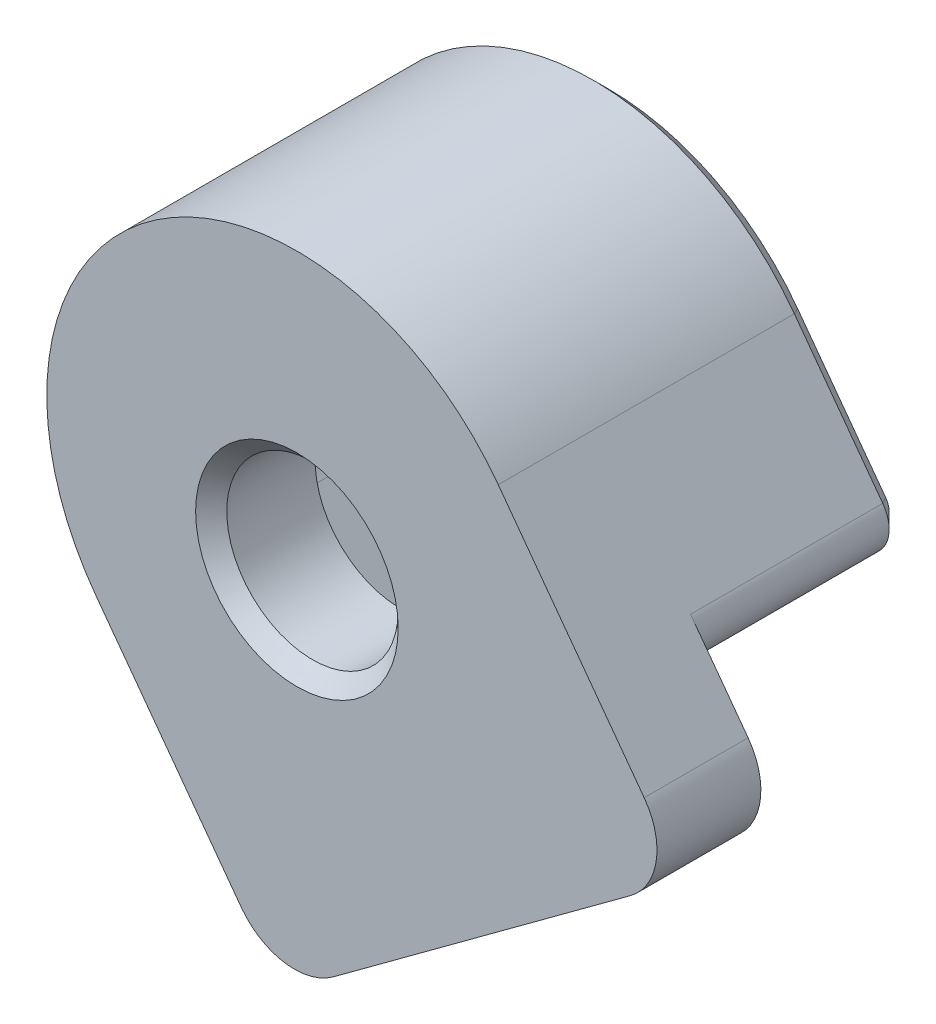
ISO-10303-21;
HEADER;
FILE_DESCRIPTION(('STEP AP214'),'2;1');
FILE_NAME('part.step','',(''),(''),'','','');
FILE_SCHEMA(('AUTOMOTIVE_DESIGN { 1 0 10303 214 1 1 1 1 }'));
ENDSEC;
DATA;
#1=APPLICATION_CONTEXT('core data for automotive mechanical design processes');
#2=APPLICATION_PROTOCOL_DEFINITION('international standard','automotive_design',2000,#1);
#3=PRODUCT_CONTEXT('',#1,'mechanical');
#4=PRODUCT('Part','Part','',(#3));
#5=PRODUCT_RELATED_PRODUCT_CATEGORY('part','',(#4));
#6=PRODUCT_DEFINITION_FORMATION('','',#4);
#7=PRODUCT_DEFINITION_CONTEXT('part definition',#1,'design');
#8=PRODUCT_DEFINITION('design','',#6,#7);
#9=PRODUCT_DEFINITION_SHAPE('','',#8);
#10=(LENGTH_UNIT() NAMED_UNIT(*) SI_UNIT(.MILLI.,.METRE.));
#11=(NAMED_UNIT(*) PLANE_ANGLE_UNIT() SI_UNIT($,.RADIAN.));
#12=(NAMED_UNIT(*) SI_UNIT($,.STERADIAN.) SOLID_ANGLE_UNIT());
#13=UNCERTAINTY_MEASURE_WITH_UNIT(LENGTH_MEASURE(1.E-05),#10,'distance_accuracy_value','');
#14=(GEOMETRIC_REPRESENTATION_CONTEXT(3) GLOBAL_UNCERTAINTY_ASSIGNED_CONTEXT((#13)) GLOBAL_UNIT_ASSIGNED_CONTEXT((#10,
#11,#12)) REPRESENTATION_CONTEXT('',''));
#15=CARTESIAN_POINT('',(0.,0.,0.));
#16=DIRECTION('',(0.,0.,1.));
#17=DIRECTION('',(1.,0.,0.));
#18=AXIS2_PLACEMENT_3D('',#15,#16,#17);
#19=CARTESIAN_POINT('',(-2.40553064477248,-2.97284184121243,-3.85));
#20=DIRECTION('',(0.569292299270593,0.419411823857176,-0.707106781186547));
#21=DIRECTION('',(-0.778926894631639,0.,-0.627114736567011));
#22=AXIS2_PLACEMENT_3D('',#19,#20,#21);
#23=PLANE('',#22);
#24=DIRECTION('',(0.569292299270616,0.419411823857143,0.707106781186548));
#25=VECTOR('',#24,1.);
#26=CARTESIAN_POINT('',(-401745.223635817,-295975.717899002,-499000.));
#27=LINE('',#26,#25);
#28=CARTESIAN_POINT('',(-3.09963842872968,-2.28358087467108,-3.9999999999955));
#29=VERTEX_POINT('',#28);
#30=CARTESIAN_POINT('',(-2.85810816154998,-2.10563950778295,-3.69999999996676));
#31=VERTEX_POINT('',#30);
#32=EDGE_CURVE('E313',#29,#31,#27,.T.);
#33=ORIENTED_EDGE('',*,*,#32,.T.);
#34=DIRECTION('',(-0.593137889518453,0.805100890583034,0.));
#35=VECTOR('',#34,1.);
#36=CARTESIAN_POINT('',(-2.85810816156989,-2.10563950779034,-3.7));
#37=LINE('',#36,#35);
#38=CARTESIAN_POINT('',(-1.15704800032344,-4.41458836262104,-3.70000000000939));
#39=VERTEX_POINT('',#38);
#40=EDGE_CURVE('E278',#39,#31,#37,.T.);
#41=ORIENTED_EDGE('',*,*,#40,.F.);
#42=CARTESIAN_POINT('',(-1.39857826747342,-4.59252972945821,-3.99999999996226));
#43=CARTESIAN_POINT('',(-1.3885145062315,-4.58511550605522,-3.98749999998533));
#44=CARTESIAN_POINT('',(-1.37845074500218,-4.57770128261609,-3.97500000001971));
#45=CARTESIAN_POINT('',(-1.35832322252214,-4.56287283565181,-3.95000000003162));
#46=CARTESIAN_POINT('',(-1.34825946127141,-4.55545861212668,-3.93750000000915));
#47=CARTESIAN_POINT('',(-1.32813193883925,-4.54063016507784,-3.91249999999846));
#48=CARTESIAN_POINT('',(-1.31806817765781,-4.53321594155415,-3.90000000001024));
#49=CARTESIAN_POINT('',(-1.29794065534354,-4.51838749442578,-3.8750000000125));
#50=CARTESIAN_POINT('',(-1.28787689421071,-4.51097327082111,-3.86250000000299));
#51=CARTESIAN_POINT('',(-1.26774937194871,-4.49614482357225,-3.8374999999892));
#52=CARTESIAN_POINT('',(-1.25768561081954,-4.48873059992806,-3.82499999998492));
#53=CARTESIAN_POINT('',(-1.23755808859704,-4.47390215259018,-3.79999999997688));
#54=CARTESIAN_POINT('',(-1.2274943275037,-4.46648792889649,-3.78749999997311));
#55=CARTESIAN_POINT('',(-1.20736680538268,-4.451659481458,-3.7624999999583));
#56=CARTESIAN_POINT('',(-1.19730304435498,-4.4442452577132,-3.74999999994726));
#57=CARTESIAN_POINT('',(-1.17717552233503,-4.42941681019444,-3.72499999996307));
#58=CARTESIAN_POINT('',(-1.16711176134277,-4.42200258642048,-3.71249999998993));
#59=CARTESIAN_POINT('',(-1.15704800033643,-4.41458836263061,-3.70000000003756));
#60=B_SPLINE_CURVE_WITH_KNOTS('',3,(#42,#43,#44,#45,#46,#47,#48,#49,#50,#51,#52,#53,#54,#55,#56,
#57,#58,#59),.UNSPECIFIED.,.F.,.F.,(4,2,2,2,2,2,2,2,4),(0.,0.053033008455504,0.106066017176354,
0.159099025704413,0.212132034296507,0.265165042920962,0.318198051545416,0.371231060137511,
0.424264068625375),.UNSPECIFIED.);
#61=CARTESIAN_POINT('',(-1.39857827143414,-4.59252972410357,-3.99999999996226));
#62=VERTEX_POINT('',#61);
#63=EDGE_CURVE('E294',#62,#39,#60,.T.);
#64=ORIENTED_EDGE('',*,*,#63,.F.);
#65=DIRECTION('',(-0.593137889518453,0.805100890583034,0.));
#66=VECTOR('',#65,1.);
#67=CARTESIAN_POINT('',(-1.39857826749393,-4.59252972947332,-4.));
#68=LINE('',#67,#66);
#69=EDGE_CURVE('E254',#62,#29,#68,.T.);
#70=ORIENTED_EDGE('',*,*,#69,.T.);
#71=EDGE_LOOP('',(#33,#41,#64,#70));
#72=FACE_BOUND('',#71,.T.);
#73=ADVANCED_FACE('F17',(#72),#23,.T.);
#74=CARTESIAN_POINT('',(0.,0.,-3.99999999990541));
#75=DIRECTION('',(0.,0.,-1.));
#76=DIRECTION('',(-1.,0.,0.));
#77=AXIS2_PLACEMENT_3D('',#74,#75,#76);
#78=CONICAL_SURFACE('',#77,3.84999999994307,0.785398163397448);
#79=CARTESIAN_POINT('',(0.,0.,-4.0000000000383));
#80=DIRECTION('',(0.,0.,-1.));
#81=DIRECTION('',(-1.,0.,0.));
#82=AXIS2_PLACEMENT_3D('',#79,#80,#81);
#83=CIRCLE('',#82,3.85000000007595);
#84=CARTESIAN_POINT('',(3.09963842876022,2.28358087465724,-4.00000000001915));
#85=VERTEX_POINT('',#84);
#86=EDGE_CURVE('E253',#29,#85,#83,.T.);
#87=ORIENTED_EDGE('',*,*,#86,.T.);
#88=DIRECTION('',(0.569292299270587,0.419411823857181,-0.707106781186549));
#89=VECTOR('',#88,1.);
#90=CARTESIAN_POINT('',(2.85810816156989,2.10563950779034,-3.7));
#91=LINE('',#90,#89);
#92=CARTESIAN_POINT('',(2.85810816156989,2.10563950779034,-3.7));
#93=VERTEX_POINT('',#92);
#94=EDGE_CURVE('E120',#93,#85,#91,.T.);
#95=ORIENTED_EDGE('',*,*,#94,.F.);
#96=CARTESIAN_POINT('',(0.,0.,-3.7));
#97=DIRECTION('',(0.,0.,-1.));
#98=DIRECTION('',(-1.,0.,0.));
#99=AXIS2_PLACEMENT_3D('',#96,#97,#98);
#100=CIRCLE('',#99,3.55);
#101=EDGE_CURVE('E289',#93,#31,#100,.F.);
#102=ORIENTED_EDGE('',*,*,#101,.T.);
#103=ORIENTED_EDGE('',*,*,#32,.F.);
#104=EDGE_LOOP('',(#87,#95,#102,#103));
#105=FACE_BOUND('',#104,.T.);
#106=ADVANCED_FACE('F375',(#105),#78,.F.);
#107=CARTESIAN_POINT('',(4.40274602221707,0.261904119172411,-3.85));
#108=DIRECTION('',(-0.569292299270594,-0.419411823857174,-0.707106781186547));
#109=DIRECTION('',(-0.778926894631638,0.,0.627114736567012));
#110=AXIS2_PLACEMENT_3D('',#107,#108,#109);
#111=PLANE('',#110);
#112=DIRECTION('',(0.569292299270617,0.419411823857142,-0.707106781186548));
#113=VECTOR('',#112,1.);
#114=CARTESIAN_POINT('',(-401743.764105931,-295978.204789212,499000.));
#115=LINE('',#114,#113);
#116=CARTESIAN_POINT('',(4.55916831493576,-0.20330933631307,-3.7000000000236));
#117=VERTEX_POINT('',#116);
#118=CARTESIAN_POINT('',(4.80069858208017,-0.0253679694886399,-3.9999999999859));
#119=VERTEX_POINT('',#118);
#120=EDGE_CURVE('E112',#117,#119,#115,.T.);
#121=ORIENTED_EDGE('',*,*,#120,.F.);
#122=DIRECTION('',(0.593137889518451,-0.805100890583036,0.));
#123=VECTOR('',#122,1.);
#124=CARTESIAN_POINT('',(4.55916831491986,-0.203309336312746,-3.7));
#125=LINE('',#124,#123);
#126=EDGE_CURVE('E263',#93,#117,#125,.T.);
#127=ORIENTED_EDGE('',*,*,#126,.F.);
#128=ORIENTED_EDGE('',*,*,#94,.T.);
#129=DIRECTION('',(0.593137889518452,-0.805100890583036,0.));
#130=VECTOR('',#129,1.);
#131=CARTESIAN_POINT('',(3.0996384287448,2.28358087464588,-4.));
#132=LINE('',#131,#130);
#133=EDGE_CURVE('E251',#85,#119,#132,.T.);
#134=ORIENTED_EDGE('',*,*,#133,.T.);
#135=EDGE_LOOP('',(#121,#127,#128,#134));
#136=FACE_BOUND('',#135,.T.);
#137=ADVANCED_FACE('F371',(#136),#111,.T.);
#138=CARTESIAN_POINT('',(-1.66595228115761,-4.78951081185811,-3.70000000009441));
#139=DIRECTION('',(0.,0.,1.));
#140=DIRECTION('',(1.,0.,0.));
#141=AXIS2_PLACEMENT_3D('',#138,#139,#140);
#142=CONICAL_SURFACE('',#141,0.632099999932773,0.785398163462924);
#143=ORIENTED_EDGE('',*,*,#63,.T.);
#144=CARTESIAN_POINT('',(-1.66595228115761,-4.78951081185811,-3.7));
#145=DIRECTION('',(0.,0.,-1.));
#146=DIRECTION('',(-1.,0.,0.));
#147=AXIS2_PLACEMENT_3D('',#144,#145,#146);
#148=CIRCLE('',#147,0.632099999999998);
#149=CARTESIAN_POINT('',(-2.17485655409512,-5.16443327182266,-3.69999999999999));
#150=VERTEX_POINT('',#149);
#151=EDGE_CURVE('E241',#150,#39,#148,.F.);
#152=ORIENTED_EDGE('',*,*,#151,.F.);
#153=DIRECTION('',(-0.569292299270606,-0.419411823857158,0.707106781186547));
#154=VECTOR('',#153,1.);
#155=CARTESIAN_POINT('',(-1.93332628692022,-4.98649190496714,-3.99999999999996));
#156=LINE('',#155,#154);
#157=CARTESIAN_POINT('',(-1.93332628693539,-4.98649190497832,-3.99999999998111));
#158=VERTEX_POINT('',#157);
#159=EDGE_CURVE('E145',#158,#150,#156,.T.);
#160=ORIENTED_EDGE('',*,*,#159,.F.);
#161=CARTESIAN_POINT('',(-1.66595228115761,-4.78951081185811,-3.99999999996226));
#162=DIRECTION('',(0.,0.,1.));
#163=DIRECTION('',(1.,0.,0.));
#164=AXIS2_PLACEMENT_3D('',#161,#162,#163);
#165=CIRCLE('',#164,0.332100000025637);
#166=EDGE_CURVE('E256',#158,#62,#165,.T.);
#167=ORIENTED_EDGE('',*,*,#166,.T.);
#168=EDGE_LOOP('',(#143,#152,#160,#167));
#169=FACE_BOUND('',#168,.T.);
#170=ADVANCED_FACE('F302',(#169),#142,.T.);
#171=CARTESIAN_POINT('',(0.,0.,0.));
#172=DIRECTION('',(0.,0.,-1.));
#173=DIRECTION('',(-1.,0.,0.));
#174=AXIS2_PLACEMENT_3D('',#171,#172,#173);
#175=CYLINDRICAL_SURFACE('',#174,3.55);
#176=DIRECTION('',(0.,0.,1.));
#177=VECTOR('',#176,1.);
#178=CARTESIAN_POINT('',(2.85810816156989,2.10563950779034,0.));
#179=LINE('',#178,#177);
#180=CARTESIAN_POINT('',(2.85810816156989,2.10563950779034,0.));
#181=VERTEX_POINT('',#180);
#182=EDGE_CURVE('E269',#181,#93,#179,.F.);
#183=ORIENTED_EDGE('',*,*,#182,.F.);
#184=CARTESIAN_POINT('',(0.,0.,0.));
#185=DIRECTION('',(0.,0.,-1.));
#186=DIRECTION('',(-1.,0.,0.));
#187=AXIS2_PLACEMENT_3D('',#184,#185,#186);
#188=CIRCLE('',#187,3.55);
#189=CARTESIAN_POINT('',(-2.85810816156989,-2.10563950779033,0.));
#190=VERTEX_POINT('',#189);
#191=EDGE_CURVE('E196',#181,#190,#188,.F.);
#192=ORIENTED_EDGE('',*,*,#191,.T.);
#193=DIRECTION('',(0.,0.,1.));
#194=VECTOR('',#193,1.);
#195=CARTESIAN_POINT('',(-2.85810816156989,-2.10563950779034,0.));
#196=LINE('',#195,#194);
#197=EDGE_CURVE('E264',#31,#190,#196,.T.);
#198=ORIENTED_EDGE('',*,*,#197,.F.);
#199=ORIENTED_EDGE('',*,*,#101,.F.);
#200=EDGE_LOOP('',(#183,#192,#198,#199));
#201=FACE_BOUND('',#200,.T.);
#202=ADVANCED_FACE('F300',(#201),#175,.F.);
#203=CARTESIAN_POINT('',(-2.85810816156989,-2.10563950779034,0.));
#204=DIRECTION('',(0.805100890583034,0.593137889518453,0.));
#205=DIRECTION('',(-0.593137889518453,0.805100890583034,0.));
#206=AXIS2_PLACEMENT_3D('',#203,#204,#205);
#207=PLANE('',#206);
#208=DIRECTION('',(0.593137889518403,-0.805100890583071,0.));
#209=VECTOR('',#208,1.);
#210=CARTESIAN_POINT('',(-2.85810816156989,-2.10563950779034,0.));
#211=LINE('',#210,#209);
#212=CARTESIAN_POINT('',(-1.15704800426961,-4.41458835725571,0.));
#213=VERTEX_POINT('',#212);
#214=EDGE_CURVE('E193',#190,#213,#211,.T.);
#215=ORIENTED_EDGE('',*,*,#214,.T.);
#216=DIRECTION('',(0.,0.,-1.));
#217=VECTOR('',#216,1.);
#218=CARTESIAN_POINT('',(-1.15704800031915,-4.41458836261788,0.));
#219=LINE('',#218,#217);
#220=EDGE_CURVE('E228',#39,#213,#219,.F.);
#221=ORIENTED_EDGE('',*,*,#220,.F.);
#222=ORIENTED_EDGE('',*,*,#40,.T.);
#223=ORIENTED_EDGE('',*,*,#197,.T.);
#224=EDGE_LOOP('',(#215,#221,#222,#223));
#225=FACE_BOUND('',#224,.T.);
#226=ADVANCED_FACE('F379',(#225),#207,.T.);
#227=CARTESIAN_POINT('',(0.,-0.5,0.));
#228=DIRECTION('',(0.,0.,1.));
#229=DIRECTION('',(1.,0.,0.));
#230=AXIS2_PLACEMENT_3D('',#227,#228,#229);
#231=CYLINDRICAL_SURFACE('',#230,1.65);
#232=CARTESIAN_POINT('',(0.,-0.5,0.));
#233=DIRECTION('',(0.,0.,1.));
#234=DIRECTION('',(1.,0.,0.));
#235=AXIS2_PLACEMENT_3D('',#232,#233,#234);
#236=CIRCLE('',#235,1.65);
#237=CARTESIAN_POINT('',(1.65,-0.5,0.));
#238=VERTEX_POINT('',#237);
#239=EDGE_CURVE('E222',#238,#238,#236,.F.);
#240=ORIENTED_EDGE('',*,*,#239,.T.);
#241=EDGE_LOOP('',(#240));
#242=FACE_BOUND('',#241,.T.);
#243=CARTESIAN_POINT('',(0.,-0.5,1.69999999997117));
#244=DIRECTION('',(0.,0.,1.));
#245=DIRECTION('',(1.,0.,0.));
#246=AXIS2_PLACEMENT_3D('',#243,#244,#245);
#247=CIRCLE('',#246,1.64999999998372);
#248=CARTESIAN_POINT('',(1.64999999998372,-0.5,1.69999999997117));
#249=VERTEX_POINT('',#248);
#250=EDGE_CURVE('E215',#249,#249,#247,.T.);
#251=ORIENTED_EDGE('',*,*,#250,.T.);
#252=EDGE_LOOP('',(#251));
#253=FACE_BOUND('',#252,.T.);
#254=ADVANCED_FACE('F541',(#242,#253),#231,.F.);
#255=CARTESIAN_POINT('',(5.06807258785729,0.171613123651743,-3.70000000020809));
#256=DIRECTION('',(0.,0.,1.));
#257=DIRECTION('',(1.,0.,0.));
#258=AXIS2_PLACEMENT_3D('',#255,#256,#257);
#259=CONICAL_SURFACE('',#258,0.632099999823846,0.78539816338665);
#260=DIRECTION('',(-0.569292299270613,-0.419411823857147,-0.707106781186548));
#261=VECTOR('',#260,1.);
#262=CARTESIAN_POINT('',(5.57697686079487,0.546535583616342,-3.70000000000002));
#263=LINE('',#262,#261);
#264=CARTESIAN_POINT('',(5.57697686079488,0.546535583616349,-3.7));
#265=VERTEX_POINT('',#264);
#266=CARTESIAN_POINT('',(5.33544659361228,0.368594216755169,-4.00000000000955));
#267=VERTEX_POINT('',#266);
#268=EDGE_CURVE('E211',#265,#267,#263,.T.);
#269=ORIENTED_EDGE('',*,*,#268,.F.);
#270=CARTESIAN_POINT('',(5.06807258785729,0.171613123651743,-3.7));
#271=DIRECTION('',(0.,0.,-1.));
#272=DIRECTION('',(-1.,0.,0.));
#273=AXIS2_PLACEMENT_3D('',#270,#271,#272);
#274=CIRCLE('',#273,0.6321);
#275=EDGE_CURVE('E218',#117,#265,#274,.F.);
#276=ORIENTED_EDGE('',*,*,#275,.F.);
#277=ORIENTED_EDGE('',*,*,#120,.T.);
#278=CARTESIAN_POINT('',(5.06807258785729,0.171613123651743,-4.0000000000191));
#279=DIRECTION('',(0.,0.,1.));
#280=DIRECTION('',(1.,0.,0.));
#281=AXIS2_PLACEMENT_3D('',#278,#279,#280);
#282=CIRCLE('',#281,0.332100000019318);
#283=EDGE_CURVE('E20',#119,#267,#282,.T.);
#284=ORIENTED_EDGE('',*,*,#283,.T.);
#285=EDGE_LOOP('',(#269,#276,#277,#284));
#286=FACE_BOUND('',#285,.T.);
#287=ADVANCED_FACE('F345',(#286),#259,.T.);
#288=CARTESIAN_POINT('',(4.55916831491986,-0.203309336312746,0.));
#289=DIRECTION('',(-0.805100890583036,-0.593137889518451,0.));
#290=DIRECTION('',(0.593137889518451,-0.805100890583036,0.));
#291=AXIS2_PLACEMENT_3D('',#288,#289,#290);
#292=PLANE('',#291);
#293=DIRECTION('',(-0.593137889518407,0.805100890583068,0.));
#294=VECTOR('',#293,1.);
#295=CARTESIAN_POINT('',(4.55916831491973,-0.203309336312842,0.));
#296=LINE('',#295,#294);
#297=CARTESIAN_POINT('',(4.55916831491973,-0.203309336312842,0.));
#298=VERTEX_POINT('',#297);
#299=EDGE_CURVE('E197',#298,#181,#296,.T.);
#300=ORIENTED_EDGE('',*,*,#299,.T.);
#301=ORIENTED_EDGE('',*,*,#182,.T.);
#302=ORIENTED_EDGE('',*,*,#126,.T.);
#303=DIRECTION('',(0.,0.,-1.));
#304=VECTOR('',#303,1.);
#305=CARTESIAN_POINT('',(4.55916831491973,-0.203309336312841,0.));
#306=LINE('',#305,#304);
#307=EDGE_CURVE('E185',#298,#117,#306,.T.);
#308=ORIENTED_EDGE('',*,*,#307,.F.);
#309=EDGE_LOOP('',(#300,#301,#302,#308));
#310=FACE_BOUND('',#309,.T.);
#311=ADVANCED_FACE('F368',(#310),#292,.T.);
#312=CARTESIAN_POINT('',(1.31027202227769,-1.43594488560902,-4.));
#313=DIRECTION('',(0.,0.,1.));
#314=DIRECTION('',(1.,0.,0.));
#315=AXIS2_PLACEMENT_3D('',#312,#313,#314);
#316=PLANE('',#315);
#317=ORIENTED_EDGE('',*,*,#86,.F.);
#318=ORIENTED_EDGE('',*,*,#69,.F.);
#319=ORIENTED_EDGE('',*,*,#166,.F.);
#320=DIRECTION('',(0.593137889518419,-0.80510089058306,0.));
#321=VECTOR('',#320,1.);
#322=CARTESIAN_POINT('',(-3.63438644027009,-2.67754306086398,-4.));
#323=LINE('',#322,#321);
#324=CARTESIAN_POINT('',(-3.63438644030327,-2.67754306086571,-4.00000000001433));
#325=VERTEX_POINT('',#324);
#326=EDGE_CURVE('E247',#325,#158,#323,.T.);
#327=ORIENTED_EDGE('',*,*,#326,.F.);
#328=CARTESIAN_POINT('',(0.,0.,-3.99999999996226));
#329=DIRECTION('',(0.,0.,1.));
#330=DIRECTION('',(1.,0.,0.));
#331=AXIS2_PLACEMENT_3D('',#328,#329,#330);
#332=CIRCLE('',#331,4.51420000006669);
#333=CARTESIAN_POINT('',(3.63438644023391,2.67754306091114,-4.00000000001432));
#334=VERTEX_POINT('',#333);
#335=EDGE_CURVE('E160',#334,#325,#332,.T.);
#336=ORIENTED_EDGE('',*,*,#335,.F.);
#337=DIRECTION('',(-0.593137889518421,0.805100890583058,0.));
#338=VECTOR('',#337,1.);
#339=CARTESIAN_POINT('',(5.33544659361997,0.368594216760833,-4.));
#340=LINE('',#339,#338);
#341=EDGE_CURVE('E214',#267,#334,#340,.T.);
#342=ORIENTED_EDGE('',*,*,#341,.F.);
#343=ORIENTED_EDGE('',*,*,#283,.F.);
#344=ORIENTED_EDGE('',*,*,#133,.F.);
#345=EDGE_LOOP('',(#317,#318,#319,#327,#336,#342,#343,#344));
#346=FACE_BOUND('',#345,.T.);
#347=ADVANCED_FACE('F350',(#346),#316,.F.);
#348=CARTESIAN_POINT('',(-3.18180892347273,-3.54474539428605,-3.85));
#349=DIRECTION('',(-0.569292299270603,-0.41941182385716,-0.707106781186548));
#350=DIRECTION('',(-0.778926894631634,0.,0.627114736567017));
#351=AXIS2_PLACEMENT_3D('',#348,#349,#350);
#352=PLANE('',#351);
#353=ORIENTED_EDGE('',*,*,#159,.T.);
#354=DIRECTION('',(0.593137889518432,-0.80510089058305,0.));
#355=VECTOR('',#354,1.);
#356=CARTESIAN_POINT('',(-3.87591670744501,-2.85548442771951,-3.7));
#357=LINE('',#356,#355);
#358=CARTESIAN_POINT('',(-3.87591670745875,-2.8554844277284,-3.69999999999518));
#359=VERTEX_POINT('',#358);
#360=EDGE_CURVE('E138',#359,#150,#357,.T.);
#361=ORIENTED_EDGE('',*,*,#360,.F.);
#362=DIRECTION('',(0.569292299274879,0.419411823851356,-0.707106781186549));
#363=VECTOR('',#362,1.);
#364=CARTESIAN_POINT('',(-401752.199193961,-295980.85696022,499000.));
#365=LINE('',#364,#363);
#366=EDGE_CURVE('E142',#325,#359,#365,.F.);
#367=ORIENTED_EDGE('',*,*,#366,.F.);
#368=ORIENTED_EDGE('',*,*,#326,.T.);
#369=EDGE_LOOP('',(#353,#361,#367,#368));
#370=FACE_BOUND('',#369,.T.);
#371=ADVANCED_FACE('F140',(#370),#352,.T.);
#372=CARTESIAN_POINT('',(-1.66595228115761,-4.78951081185811,0.));
#373=DIRECTION('',(0.,0.,-1.));
#374=DIRECTION('',(-1.,0.,0.));
#375=AXIS2_PLACEMENT_3D('',#372,#373,#374);
#376=CYLINDRICAL_SURFACE('',#375,0.632099999999998);
#377=CARTESIAN_POINT('',(-1.66595228115761,-4.78951081185811,0.));
#378=DIRECTION('',(0.,0.,-1.));
#379=DIRECTION('',(-1.,0.,0.));
#380=AXIS2_PLACEMENT_3D('',#377,#378,#379);
#381=CIRCLE('',#380,0.632099999999998);
#382=CARTESIAN_POINT('',(-2.17485655409509,-5.16443327182265,0.));
#383=VERTEX_POINT('',#382);
#384=EDGE_CURVE('E195',#213,#383,#381,.T.);
#385=ORIENTED_EDGE('',*,*,#384,.T.);
#386=DIRECTION('',(0.,0.,1.));
#387=VECTOR('',#386,1.);
#388=CARTESIAN_POINT('',(-2.17485655409509,-5.16443327182264,0.));
#389=LINE('',#388,#387);
#390=EDGE_CURVE('E150',#150,#383,#389,.T.);
#391=ORIENTED_EDGE('',*,*,#390,.F.);
#392=ORIENTED_EDGE('',*,*,#151,.T.);
#393=ORIENTED_EDGE('',*,*,#220,.T.);
#394=EDGE_LOOP('',(#385,#391,#392,#393));
#395=FACE_BOUND('',#394,.T.);
#396=ADVANCED_FACE('F382',(#395),#376,.T.);
#397=CARTESIAN_POINT('',(-0.0491257443883788,-5.91843630541345,0.));
#398=DIRECTION('',(0.,0.,1.));
#399=DIRECTION('',(1.,0.,0.));
#400=AXIS2_PLACEMENT_3D('',#397,#398,#399);
#401=CYLINDRICAL_SURFACE('',#400,1.26420000000025);
#402=CARTESIAN_POINT('',(-0.0491257443883788,-5.91843630541345,2.));
#403=DIRECTION('',(0.,0.,1.));
#404=DIRECTION('',(1.,0.,0.));
#405=AXIS2_PLACEMENT_3D('',#402,#403,#404);
#406=CIRCLE('',#405,1.26420000000025);
#407=CARTESIAN_POINT('',(-1.06693429026364,-6.66828122534276,2.));
#408=VERTEX_POINT('',#407);
#409=CARTESIAN_POINT('',(0.700719175540955,-6.93624485128873,2.));
#410=VERTEX_POINT('',#409);
#411=EDGE_CURVE('E326',#408,#410,#406,.T.);
#412=ORIENTED_EDGE('',*,*,#411,.F.);
#413=DIRECTION('',(0.,0.,1.));
#414=VECTOR('',#413,1.);
#415=CARTESIAN_POINT('',(-1.0669342902636,-6.66828122534274,0.));
#416=LINE('',#415,#414);
#417=CARTESIAN_POINT('',(-1.0669342902636,-6.66828122534274,0.));
#418=VERTEX_POINT('',#417);
#419=EDGE_CURVE('E229',#418,#408,#416,.T.);
#420=ORIENTED_EDGE('',*,*,#419,.F.);
#421=CARTESIAN_POINT('',(-0.0491257443883788,-5.91843630541345,0.));
#422=DIRECTION('',(0.,0.,1.));
#423=DIRECTION('',(1.,0.,0.));
#424=AXIS2_PLACEMENT_3D('',#421,#422,#423);
#425=CIRCLE('',#424,1.26420000000025);
#426=CARTESIAN_POINT('',(0.700719175540955,-6.93624485128873,0.));
#427=VERTEX_POINT('',#426);
#428=EDGE_CURVE('E203',#418,#427,#425,.T.);
#429=ORIENTED_EDGE('',*,*,#428,.T.);
#430=DIRECTION('',(0.,0.,1.));
#431=VECTOR('',#430,1.);
#432=CARTESIAN_POINT('',(0.700719175540944,-6.93624485128871,0.));
#433=LINE('',#432,#431);
#434=EDGE_CURVE('E225',#410,#427,#433,.F.);
#435=ORIENTED_EDGE('',*,*,#434,.F.);
#436=EDGE_LOOP('',(#412,#420,#429,#435));
#437=FACE_BOUND('',#436,.T.);
#438=ADVANCED_FACE('F387',(#437),#401,.T.);
#439=CARTESIAN_POINT('',(0.700719175540945,-6.93624485128871,0.));
#440=DIRECTION('',(0.593137889518451,-0.805100890583036,0.));
#441=DIRECTION('',(0.805100890583036,0.593137889518451,0.));
#442=AXIS2_PLACEMENT_3D('',#439,#440,#441);
#443=PLANE('',#442);
#444=DIRECTION('',(0.805100890583052,0.59313788951843,0.));
#445=VECTOR('',#444,1.);
#446=CARTESIAN_POINT('',(0.700719175540966,-6.93624485128874,2.));
#447=LINE('',#446,#445);
#448=CARTESIAN_POINT('',(6.41693549868062,-2.7249658357079,2.));
#449=VERTEX_POINT('',#448);
#450=EDGE_CURVE('E325',#410,#449,#447,.T.);
#451=ORIENTED_EDGE('',*,*,#450,.F.);
#452=ORIENTED_EDGE('',*,*,#434,.T.);
#453=DIRECTION('',(0.805100890583052,0.59313788951843,0.));
#454=VECTOR('',#453,1.);
#455=CARTESIAN_POINT('',(0.700719175540966,-6.93624485128874,0.));
#456=LINE('',#455,#454);
#457=CARTESIAN_POINT('',(6.41693549868062,-2.7249658357079,0.));
#458=VERTEX_POINT('',#457);
#459=EDGE_CURVE('E201',#427,#458,#456,.T.);
#460=ORIENTED_EDGE('',*,*,#459,.T.);
#461=DIRECTION('',(0.,0.,1.));
#462=VECTOR('',#461,1.);
#463=CARTESIAN_POINT('',(6.41693549868062,-2.7249658357079,0.));
#464=LINE('',#463,#462);
#465=EDGE_CURVE('E233',#449,#458,#464,.F.);
#466=ORIENTED_EDGE('',*,*,#465,.F.);
#467=EDGE_LOOP('',(#451,#452,#460,#466));
#468=FACE_BOUND('',#467,.T.);
#469=ADVANCED_FACE('F400',(#468),#443,.T.);
#470=CARTESIAN_POINT('',(0.,-0.5,2.00000000000955));
#471=DIRECTION('',(0.,0.,1.));
#472=DIRECTION('',(1.,0.,0.));
#473=AXIS2_PLACEMENT_3D('',#470,#471,#472);
#474=CONICAL_SURFACE('',#473,1.95000000007894,0.785398163492187);
#475=ORIENTED_EDGE('',*,*,#250,.F.);
#476=EDGE_LOOP('',(#475));
#477=FACE_BOUND('',#476,.T.);
#478=CARTESIAN_POINT('',(0.,-0.5,2.00000000000955));
#479=DIRECTION('',(0.,0.,1.));
#480=DIRECTION('',(1.,0.,0.));
#481=AXIS2_PLACEMENT_3D('',#478,#479,#480);
#482=CIRCLE('',#481,1.95000000007894);
#483=CARTESIAN_POINT('',(1.95000000007894,-0.5,2.00000000000955));
#484=VERTEX_POINT('',#483);
#485=EDGE_CURVE('E190',#484,#484,#482,.F.);
#486=ORIENTED_EDGE('',*,*,#485,.F.);
#487=EDGE_LOOP('',(#486));
#488=FACE_BOUND('',#487,.T.);
#489=ADVANCED_FACE('F412',(#477,#488),#474,.F.);
#490=CARTESIAN_POINT('',(5.73298543283303,0.0818836954858171,-3.85));
#491=DIRECTION('',(0.569292299270609,0.419411823857153,-0.707106781186547));
#492=DIRECTION('',(-0.77892689463163,0.,-0.627114736567022));
#493=AXIS2_PLACEMENT_3D('',#490,#491,#492);
#494=PLANE('',#493);
#495=DIRECTION('',(-0.569292299270616,-0.419411823857142,-0.707106781186549));
#496=VECTOR('',#495,1.);
#497=CARTESIAN_POINT('',(401752.199190953,295980.856964303,499000.));
#498=LINE('',#497,#496);
#499=CARTESIAN_POINT('',(3.87591670743033,2.85548442771419,-3.7000000000236));
#500=VERTEX_POINT('',#499);
#501=EDGE_CURVE('E183',#500,#334,#498,.T.);
#502=ORIENTED_EDGE('',*,*,#501,.F.);
#503=DIRECTION('',(-0.593137889518421,0.805100890583058,0.));
#504=VECTOR('',#503,1.);
#505=CARTESIAN_POINT('',(6.68489912462648,-0.957312369903918,-3.7));
#506=LINE('',#505,#504);
#507=EDGE_CURVE('E188',#265,#500,#506,.T.);
#508=ORIENTED_EDGE('',*,*,#507,.F.);
#509=ORIENTED_EDGE('',*,*,#268,.T.);
#510=ORIENTED_EDGE('',*,*,#341,.T.);
#511=EDGE_LOOP('',(#502,#508,#509,#510));
#512=FACE_BOUND('',#511,.T.);
#513=ADVANCED_FACE('F352',(#512),#494,.T.);
#514=CARTESIAN_POINT('',(5.66709057875156,-1.70715728983299,0.));
#515=DIRECTION('',(0.,0.,1.));
#516=DIRECTION('',(1.,0.,0.));
#517=AXIS2_PLACEMENT_3D('',#514,#515,#516);
#518=CYLINDRICAL_SURFACE('',#517,1.26419999999977);
#519=CARTESIAN_POINT('',(5.66709057875156,-1.70715728983299,2.));
#520=DIRECTION('',(0.,0.,1.));
#521=DIRECTION('',(1.,0.,0.));
#522=AXIS2_PLACEMENT_3D('',#519,#520,#521);
#523=CIRCLE('',#522,1.26419999999977);
#524=CARTESIAN_POINT('',(6.68489912462649,-0.957312369903924,2.));
#525=VERTEX_POINT('',#524);
#526=EDGE_CURVE('E231',#449,#525,#523,.T.);
#527=ORIENTED_EDGE('',*,*,#526,.F.);
#528=ORIENTED_EDGE('',*,*,#465,.T.);
#529=CARTESIAN_POINT('',(5.66709057875156,-1.70715728983299,0.));
#530=DIRECTION('',(0.,0.,1.));
#531=DIRECTION('',(1.,0.,0.));
#532=AXIS2_PLACEMENT_3D('',#529,#530,#531);
#533=CIRCLE('',#532,1.26419999999977);
#534=CARTESIAN_POINT('',(6.68489912462649,-0.957312369903924,0.));
#535=VERTEX_POINT('',#534);
#536=EDGE_CURVE('E200',#458,#535,#533,.T.);
#537=ORIENTED_EDGE('',*,*,#536,.T.);
#538=DIRECTION('',(0.,0.,1.));
#539=VECTOR('',#538,1.);
#540=CARTESIAN_POINT('',(6.68489912462648,-0.957312369903919,0.));
#541=LINE('',#540,#539);
#542=EDGE_CURVE('E204',#525,#535,#541,.F.);
#543=ORIENTED_EDGE('',*,*,#542,.F.);
#544=EDGE_LOOP('',(#527,#528,#537,#543));
#545=FACE_BOUND('',#544,.T.);
#546=ADVANCED_FACE('F402',(#545),#518,.T.);
#547=CARTESIAN_POINT('',(1.05854528937567,-1.18421815270685,0.));
#548=DIRECTION('',(0.,0.,1.));
#549=DIRECTION('',(1.,0.,0.));
#550=AXIS2_PLACEMENT_3D('',#547,#548,#549);
#551=PLANE('',#550);
#552=ORIENTED_EDGE('',*,*,#239,.F.);
#553=EDGE_LOOP('',(#552));
#554=FACE_BOUND('',#553,.T.);
#555=ORIENTED_EDGE('',*,*,#214,.F.);
#556=ORIENTED_EDGE('',*,*,#191,.F.);
#557=ORIENTED_EDGE('',*,*,#299,.F.);
#558=CARTESIAN_POINT('',(5.06807258785729,0.171613123651743,0.));
#559=DIRECTION('',(0.,0.,-1.));
#560=DIRECTION('',(-1.,0.,0.));
#561=AXIS2_PLACEMENT_3D('',#558,#559,#560);
#562=CIRCLE('',#561,0.6321);
#563=CARTESIAN_POINT('',(5.57697686079489,0.546535583616362,0.));
#564=VERTEX_POINT('',#563);
#565=EDGE_CURVE('E221',#564,#298,#562,.T.);
#566=ORIENTED_EDGE('',*,*,#565,.F.);
#567=DIRECTION('',(-0.593137889518421,0.805100890583058,0.));
#568=VECTOR('',#567,1.);
#569=CARTESIAN_POINT('',(6.68489912462648,-0.957312369903918,0.));
#570=LINE('',#569,#568);
#571=EDGE_CURVE('E174',#535,#564,#570,.T.);
#572=ORIENTED_EDGE('',*,*,#571,.F.);
#573=ORIENTED_EDGE('',*,*,#536,.F.);
#574=ORIENTED_EDGE('',*,*,#459,.F.);
#575=ORIENTED_EDGE('',*,*,#428,.F.);
#576=DIRECTION('',(0.593137889518432,-0.80510089058305,0.));
#577=VECTOR('',#576,1.);
#578=CARTESIAN_POINT('',(-3.87591670744501,-2.85548442771951,0.));
#579=LINE('',#578,#577);
#580=EDGE_CURVE('E232',#383,#418,#579,.T.);
#581=ORIENTED_EDGE('',*,*,#580,.F.);
#582=ORIENTED_EDGE('',*,*,#384,.F.);
#583=EDGE_LOOP('',(#555,#556,#557,#566,#572,#573,#574,#575,#581,#582));
#584=FACE_BOUND('',#583,.T.);
#585=ADVANCED_FACE('F364',(#554,#584),#551,.F.);
#586=CARTESIAN_POINT('',(5.06807258785729,0.171613123651743,0.));
#587=DIRECTION('',(0.,0.,-1.));
#588=DIRECTION('',(-1.,0.,0.));
#589=AXIS2_PLACEMENT_3D('',#586,#587,#588);
#590=CYLINDRICAL_SURFACE('',#589,0.6321);
#591=ORIENTED_EDGE('',*,*,#565,.T.);
#592=ORIENTED_EDGE('',*,*,#307,.T.);
#593=ORIENTED_EDGE('',*,*,#275,.T.);
#594=DIRECTION('',(0.,0.,1.));
#595=VECTOR('',#594,1.);
#596=CARTESIAN_POINT('',(5.57697686079489,0.546535583616357,0.));
#597=LINE('',#596,#595);
#598=EDGE_CURVE('E171',#564,#265,#597,.F.);
#599=ORIENTED_EDGE('',*,*,#598,.F.);
#600=EDGE_LOOP('',(#591,#592,#593,#599));
#601=FACE_BOUND('',#600,.T.);
#602=ADVANCED_FACE('F356',(#601),#590,.T.);
#603=CARTESIAN_POINT('',(0.,0.,-3.70000000009441));
#604=DIRECTION('',(0.,0.,1.));
#605=DIRECTION('',(1.,0.,0.));
#606=AXIS2_PLACEMENT_3D('',#603,#604,#605);
#607=CONICAL_SURFACE('',#606,4.8141999999401,0.78539816340673);
#608=ORIENTED_EDGE('',*,*,#366,.T.);
#609=CARTESIAN_POINT('',(0.,0.,-3.7));
#610=DIRECTION('',(0.,0.,1.));
#611=DIRECTION('',(1.,0.,0.));
#612=AXIS2_PLACEMENT_3D('',#609,#610,#611);
#613=CIRCLE('',#612,4.8142);
#614=EDGE_CURVE('E157',#500,#359,#613,.T.);
#615=ORIENTED_EDGE('',*,*,#614,.F.);
#616=ORIENTED_EDGE('',*,*,#501,.T.);
#617=ORIENTED_EDGE('',*,*,#335,.T.);
#618=EDGE_LOOP('',(#608,#615,#616,#617));
#619=FACE_BOUND('',#618,.T.);
#620=ADVANCED_FACE('F154',(#619),#607,.T.);
#621=CARTESIAN_POINT('',(-3.87591670744501,-2.85548442771951,0.));
#622=DIRECTION('',(-0.80510089058305,-0.593137889518432,0.));
#623=DIRECTION('',(0.593137889518432,-0.80510089058305,0.));
#624=AXIS2_PLACEMENT_3D('',#621,#622,#623);
#625=PLANE('',#624);
#626=DIRECTION('',(0.593137889518418,-0.80510089058306,0.));
#627=VECTOR('',#626,1.);
#628=CARTESIAN_POINT('',(-3.87591670744501,-2.85548442771951,2.));
#629=LINE('',#628,#627);
#630=CARTESIAN_POINT('',(-3.87591670744499,-2.85548442771954,2.));
#631=VERTEX_POINT('',#630);
#632=EDGE_CURVE('E166',#631,#408,#629,.T.);
#633=ORIENTED_EDGE('',*,*,#632,.F.);
#634=DIRECTION('',(0.,0.,1.));
#635=VECTOR('',#634,1.);
#636=CARTESIAN_POINT('',(-3.87591670744501,-2.85548442771951,0.));
#637=LINE('',#636,#635);
#638=EDGE_CURVE('E163',#359,#631,#637,.T.);
#639=ORIENTED_EDGE('',*,*,#638,.F.);
#640=ORIENTED_EDGE('',*,*,#360,.T.);
#641=ORIENTED_EDGE('',*,*,#390,.T.);
#642=ORIENTED_EDGE('',*,*,#580,.T.);
#643=ORIENTED_EDGE('',*,*,#419,.T.);
#644=EDGE_LOOP('',(#633,#639,#640,#641,#642,#643));
#645=FACE_BOUND('',#644,.T.);
#646=ADVANCED_FACE('F164',(#645),#625,.T.);
#647=CARTESIAN_POINT('',(1.05854528937567,-1.18421815270685,2.));
#648=DIRECTION('',(0.,0.,1.));
#649=DIRECTION('',(1.,0.,0.));
#650=AXIS2_PLACEMENT_3D('',#647,#648,#649);
#651=PLANE('',#650);
#652=ORIENTED_EDGE('',*,*,#485,.T.);
#653=EDGE_LOOP('',(#652));
#654=FACE_BOUND('',#653,.T.);
#655=ORIENTED_EDGE('',*,*,#411,.T.);
#656=ORIENTED_EDGE('',*,*,#450,.T.);
#657=ORIENTED_EDGE('',*,*,#526,.T.);
#658=DIRECTION('',(-0.593137889518421,0.805100890583058,0.));
#659=VECTOR('',#658,1.);
#660=CARTESIAN_POINT('',(6.68489912462648,-0.957312369903918,2.));
#661=LINE('',#660,#659);
#662=CARTESIAN_POINT('',(3.87591670744498,2.85548442771955,2.));
#663=VERTEX_POINT('',#662);
#664=EDGE_CURVE('E35',#663,#525,#661,.F.);
#665=ORIENTED_EDGE('',*,*,#664,.F.);
#666=CARTESIAN_POINT('',(0.,0.,2.));
#667=DIRECTION('',(0.,0.,1.));
#668=DIRECTION('',(1.,0.,0.));
#669=AXIS2_PLACEMENT_3D('',#666,#667,#668);
#670=CIRCLE('',#669,4.8142);
#671=EDGE_CURVE('E26',#631,#663,#670,.F.);
#672=ORIENTED_EDGE('',*,*,#671,.F.);
#673=ORIENTED_EDGE('',*,*,#632,.T.);
#674=EDGE_LOOP('',(#655,#656,#657,#665,#672,#673));
#675=FACE_BOUND('',#674,.T.);
#676=ADVANCED_FACE('F390',(#654,#675),#651,.T.);
#677=CARTESIAN_POINT('',(6.68489912462648,-0.957312369903918,0.));
#678=DIRECTION('',(0.805100890583058,0.593137889518421,0.));
#679=DIRECTION('',(-0.593137889518421,0.805100890583058,0.));
#680=AXIS2_PLACEMENT_3D('',#677,#678,#679);
#681=PLANE('',#680);
#682=ORIENTED_EDGE('',*,*,#571,.T.);
#683=ORIENTED_EDGE('',*,*,#598,.T.);
#684=ORIENTED_EDGE('',*,*,#507,.T.);
#685=DIRECTION('',(0.,0.,1.));
#686=VECTOR('',#685,1.);
#687=CARTESIAN_POINT('',(3.87591670744501,2.85548442771951,0.));
#688=LINE('',#687,#686);
#689=EDGE_CURVE('E11',#663,#500,#688,.F.);
#690=ORIENTED_EDGE('',*,*,#689,.F.);
#691=ORIENTED_EDGE('',*,*,#664,.T.);
#692=ORIENTED_EDGE('',*,*,#542,.T.);
#693=EDGE_LOOP('',(#682,#683,#684,#690,#691,#692));
#694=FACE_BOUND('',#693,.T.);
#695=ADVANCED_FACE('F358',(#694),#681,.T.);
#696=CARTESIAN_POINT('',(0.,0.,0.));
#697=DIRECTION('',(0.,0.,1.));
#698=DIRECTION('',(1.,0.,0.));
#699=AXIS2_PLACEMENT_3D('',#696,#697,#698);
#700=CYLINDRICAL_SURFACE('',#699,4.8142);
#701=ORIENTED_EDGE('',*,*,#671,.T.);
#702=ORIENTED_EDGE('',*,*,#689,.T.);
#703=ORIENTED_EDGE('',*,*,#614,.T.);
#704=ORIENTED_EDGE('',*,*,#638,.T.);
#705=EDGE_LOOP('',(#701,#702,#703,#704));
#706=FACE_BOUND('',#705,.T.);
#707=ADVANCED_FACE('F170',(#706),#700,.T.);
#708=CLOSED_SHELL('',(#73,#106,#137,#170,#202,#226,#254,#287,#311,#347,#371,#396,#438,#469,#489,
#513,#546,#585,#602,#620,#646,#676,#695,#707));
#709=MANIFOLD_SOLID_BREP('B1',#708);
#710=ADVANCED_BREP_SHAPE_REPRESENTATION('',(#18,#709),#14);
#711=SHAPE_DEFINITION_REPRESENTATION(#9,#710);
ENDSEC;
END-ISO-10303-21;
